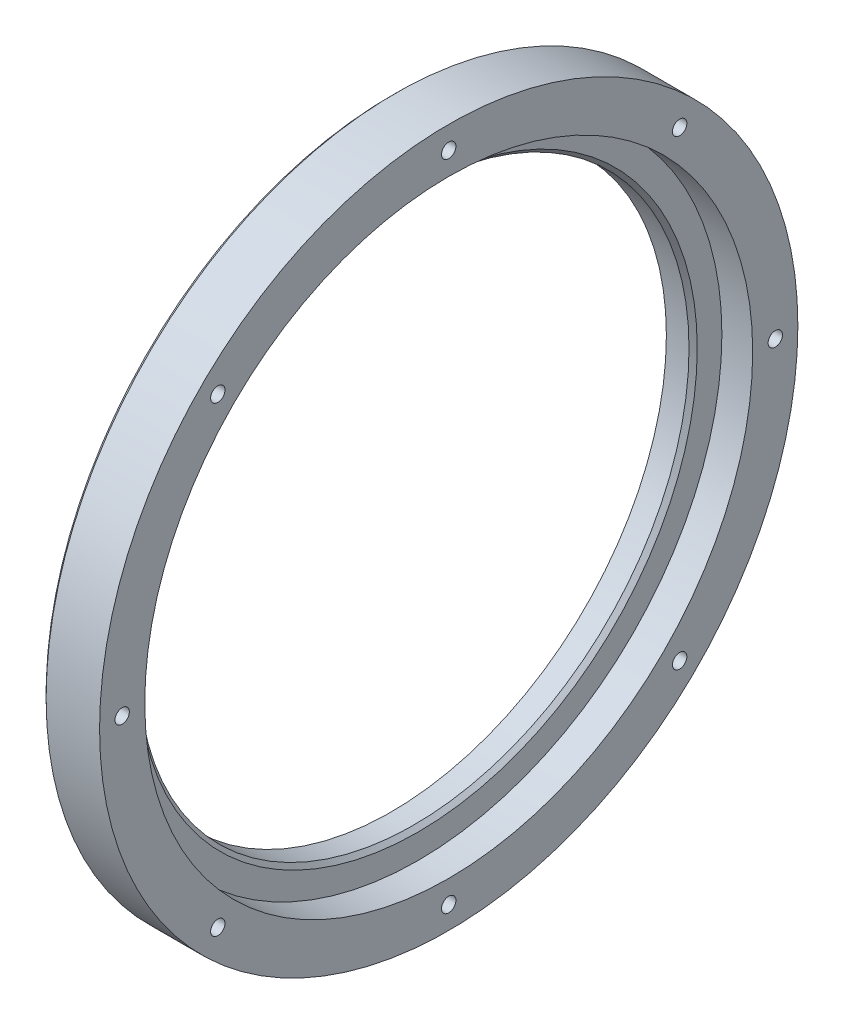
ISO-10303-21;
HEADER;
FILE_DESCRIPTION(('STEP AP214'),'2;1');
FILE_NAME('part.step','',(''),(''),'','','');
FILE_SCHEMA(('AUTOMOTIVE_DESIGN { 1 0 10303 214 1 1 1 1 }'));
ENDSEC;
DATA;
#1=APPLICATION_CONTEXT('core data for automotive mechanical design processes');
#2=APPLICATION_PROTOCOL_DEFINITION('international standard','automotive_design',2000,#1);
#3=PRODUCT_CONTEXT('',#1,'mechanical');
#4=PRODUCT('Part','Part','',(#3));
#5=PRODUCT_RELATED_PRODUCT_CATEGORY('part','',(#4));
#6=PRODUCT_DEFINITION_FORMATION('','',#4);
#7=PRODUCT_DEFINITION_CONTEXT('part definition',#1,'design');
#8=PRODUCT_DEFINITION('design','',#6,#7);
#9=PRODUCT_DEFINITION_SHAPE('','',#8);
#10=(LENGTH_UNIT() NAMED_UNIT(*) SI_UNIT(.MILLI.,.METRE.));
#11=(NAMED_UNIT(*) PLANE_ANGLE_UNIT() SI_UNIT($,.RADIAN.));
#12=(NAMED_UNIT(*) SI_UNIT($,.STERADIAN.) SOLID_ANGLE_UNIT());
#13=UNCERTAINTY_MEASURE_WITH_UNIT(LENGTH_MEASURE(1.E-05),#10,'distance_accuracy_value','');
#14=(GEOMETRIC_REPRESENTATION_CONTEXT(3) GLOBAL_UNCERTAINTY_ASSIGNED_CONTEXT((#13)) GLOBAL_UNIT_ASSIGNED_CONTEXT((#10,
#11,#12)) REPRESENTATION_CONTEXT('',''));
#15=CARTESIAN_POINT('',(0.,0.,0.));
#16=DIRECTION('',(0.,0.,1.));
#17=DIRECTION('',(1.,0.,0.));
#18=AXIS2_PLACEMENT_3D('',#15,#16,#17);
#19=CARTESIAN_POINT('',(-272.858046522507,57.2242590790327,56.2149891043305));
#20=DIRECTION('',(-1.,0.,0.));
#21=DIRECTION('',(0.,0.,1.));
#22=AXIS2_PLACEMENT_3D('',#19,#20,#21);
#23=CYLINDRICAL_SURFACE('',#22,1.75000000000001);
#24=CARTESIAN_POINT('',(-272.858046522507,57.2242590790327,56.2149891043305));
#25=DIRECTION('',(-1.,0.,0.));
#26=DIRECTION('',(0.,0.,1.));
#27=AXIS2_PLACEMENT_3D('',#24,#25,#26);
#28=CIRCLE('',#27,1.75000000000001);
#29=CARTESIAN_POINT('',(-272.858046522507,57.2242590790327,57.9649891043306));
#30=VERTEX_POINT('',#29);
#31=EDGE_CURVE('E92',#30,#30,#28,.T.);
#32=ORIENTED_EDGE('',*,*,#31,.F.);
#33=EDGE_LOOP('',(#32));
#34=FACE_BOUND('',#33,.T.);
#35=CARTESIAN_POINT('',(-282.871214875946,57.2242590790327,56.2149891043305));
#36=DIRECTION('',(-1.,0.,0.));
#37=DIRECTION('',(0.,0.,1.));
#38=AXIS2_PLACEMENT_3D('',#35,#36,#37);
#39=CIRCLE('',#38,1.75000000000001);
#40=CARTESIAN_POINT('',(-282.871214875946,57.2242590790327,57.9649891043306));
#41=VERTEX_POINT('',#40);
#42=EDGE_CURVE('E55',#41,#41,#39,.F.);
#43=ORIENTED_EDGE('',*,*,#42,.F.);
#44=EDGE_LOOP('',(#43));
#45=FACE_BOUND('',#44,.T.);
#46=ADVANCED_FACE('F36',(#34,#45),#23,.F.);
#47=CARTESIAN_POINT('',(-272.858046522507,80.5092699747022,0.));
#48=DIRECTION('',(-1.,0.,0.));
#49=DIRECTION('',(0.,0.,1.));
#50=AXIS2_PLACEMENT_3D('',#47,#48,#49);
#51=CYLINDRICAL_SURFACE('',#50,1.75000000000001);
#52=CARTESIAN_POINT('',(-272.858046522507,80.5092699747022,0.));
#53=DIRECTION('',(-1.,0.,0.));
#54=DIRECTION('',(0.,0.,1.));
#55=AXIS2_PLACEMENT_3D('',#52,#53,#54);
#56=CIRCLE('',#55,1.75000000000001);
#57=CARTESIAN_POINT('',(-272.858046522507,80.5092699747022,1.75000000000001));
#58=VERTEX_POINT('',#57);
#59=EDGE_CURVE('E129',#58,#58,#56,.T.);
#60=ORIENTED_EDGE('',*,*,#59,.F.);
#61=EDGE_LOOP('',(#60));
#62=FACE_BOUND('',#61,.T.);
#63=CARTESIAN_POINT('',(-282.871214875946,80.5092699747022,0.));
#64=DIRECTION('',(-1.,0.,0.));
#65=DIRECTION('',(0.,0.,1.));
#66=AXIS2_PLACEMENT_3D('',#63,#64,#65);
#67=CIRCLE('',#66,1.75000000000001);
#68=CARTESIAN_POINT('',(-282.871214875946,80.5092699747022,1.75000000000001));
#69=VERTEX_POINT('',#68);
#70=EDGE_CURVE('E60',#69,#69,#67,.F.);
#71=ORIENTED_EDGE('',*,*,#70,.F.);
#72=EDGE_LOOP('',(#71));
#73=FACE_BOUND('',#72,.T.);
#74=ADVANCED_FACE('F235',(#62,#73),#51,.F.);
#75=CARTESIAN_POINT('',(-272.858046522507,57.2242590790327,-56.2149891043305));
#76=DIRECTION('',(-1.,0.,0.));
#77=DIRECTION('',(0.,0.,1.));
#78=AXIS2_PLACEMENT_3D('',#75,#76,#77);
#79=CYLINDRICAL_SURFACE('',#78,1.75000000000001);
#80=CARTESIAN_POINT('',(-272.858046522507,57.2242590790327,-56.2149891043305));
#81=DIRECTION('',(-1.,0.,0.));
#82=DIRECTION('',(0.,0.,1.));
#83=AXIS2_PLACEMENT_3D('',#80,#81,#82);
#84=CIRCLE('',#83,1.75000000000001);
#85=CARTESIAN_POINT('',(-272.858046522507,57.2242590790327,-54.4649891043305));
#86=VERTEX_POINT('',#85);
#87=EDGE_CURVE('E126',#86,#86,#84,.T.);
#88=ORIENTED_EDGE('',*,*,#87,.F.);
#89=EDGE_LOOP('',(#88));
#90=FACE_BOUND('',#89,.T.);
#91=CARTESIAN_POINT('',(-282.871214875946,57.2242590790327,-56.2149891043305));
#92=DIRECTION('',(-1.,0.,0.));
#93=DIRECTION('',(0.,0.,1.));
#94=AXIS2_PLACEMENT_3D('',#91,#92,#93);
#95=CIRCLE('',#94,1.75000000000001);
#96=CARTESIAN_POINT('',(-282.871214875946,57.2242590790327,-54.4649891043305));
#97=VERTEX_POINT('',#96);
#98=EDGE_CURVE('E65',#97,#97,#95,.F.);
#99=ORIENTED_EDGE('',*,*,#98,.F.);
#100=EDGE_LOOP('',(#99));
#101=FACE_BOUND('',#100,.T.);
#102=ADVANCED_FACE('F241',(#90,#101),#79,.F.);
#103=CARTESIAN_POINT('',(-272.858046522507,1.00926997470218,-79.5));
#104=DIRECTION('',(-1.,0.,0.));
#105=DIRECTION('',(0.,0.,1.));
#106=AXIS2_PLACEMENT_3D('',#103,#104,#105);
#107=CYLINDRICAL_SURFACE('',#106,1.75);
#108=CARTESIAN_POINT('',(-272.858046522507,1.00926997470218,-79.5));
#109=DIRECTION('',(-1.,0.,0.));
#110=DIRECTION('',(0.,0.,1.));
#111=AXIS2_PLACEMENT_3D('',#108,#109,#110);
#112=CIRCLE('',#111,1.75);
#113=CARTESIAN_POINT('',(-272.858046522507,1.00926997470218,-77.75));
#114=VERTEX_POINT('',#113);
#115=EDGE_CURVE('E123',#114,#114,#112,.T.);
#116=ORIENTED_EDGE('',*,*,#115,.F.);
#117=EDGE_LOOP('',(#116));
#118=FACE_BOUND('',#117,.T.);
#119=CARTESIAN_POINT('',(-282.871214875946,1.00926997470218,-79.5));
#120=DIRECTION('',(-1.,0.,0.));
#121=DIRECTION('',(0.,0.,1.));
#122=AXIS2_PLACEMENT_3D('',#119,#120,#121);
#123=CIRCLE('',#122,1.75);
#124=CARTESIAN_POINT('',(-282.871214875946,1.00926997470218,-77.75));
#125=VERTEX_POINT('',#124);
#126=EDGE_CURVE('E70',#125,#125,#123,.F.);
#127=ORIENTED_EDGE('',*,*,#126,.F.);
#128=EDGE_LOOP('',(#127));
#129=FACE_BOUND('',#128,.T.);
#130=ADVANCED_FACE('F252',(#118,#129),#107,.F.);
#131=CARTESIAN_POINT('',(-272.858046522507,-55.2057191296284,-56.2149891043306));
#132=DIRECTION('',(-1.,0.,0.));
#133=DIRECTION('',(0.,0.,1.));
#134=AXIS2_PLACEMENT_3D('',#131,#132,#133);
#135=CYLINDRICAL_SURFACE('',#134,1.75000000000001);
#136=CARTESIAN_POINT('',(-272.858046522507,-55.2057191296284,-56.2149891043306));
#137=DIRECTION('',(-1.,0.,0.));
#138=DIRECTION('',(0.,0.,1.));
#139=AXIS2_PLACEMENT_3D('',#136,#137,#138);
#140=CIRCLE('',#139,1.75000000000001);
#141=CARTESIAN_POINT('',(-272.858046522507,-55.2057191296284,-54.4649891043305));
#142=VERTEX_POINT('',#141);
#143=EDGE_CURVE('E120',#142,#142,#140,.T.);
#144=ORIENTED_EDGE('',*,*,#143,.F.);
#145=EDGE_LOOP('',(#144));
#146=FACE_BOUND('',#145,.T.);
#147=CARTESIAN_POINT('',(-282.871214875946,-55.2057191296284,-56.2149891043306));
#148=DIRECTION('',(-1.,0.,0.));
#149=DIRECTION('',(0.,0.,1.));
#150=AXIS2_PLACEMENT_3D('',#147,#148,#149);
#151=CIRCLE('',#150,1.75000000000001);
#152=CARTESIAN_POINT('',(-282.871214875946,-55.2057191296284,-54.4649891043305));
#153=VERTEX_POINT('',#152);
#154=EDGE_CURVE('E75',#153,#153,#151,.F.);
#155=ORIENTED_EDGE('',*,*,#154,.F.);
#156=EDGE_LOOP('',(#155));
#157=FACE_BOUND('',#156,.T.);
#158=ADVANCED_FACE('F256',(#146,#157),#135,.F.);
#159=CARTESIAN_POINT('',(-272.858046522507,-78.4907300252979,0.));
#160=DIRECTION('',(-1.,0.,0.));
#161=DIRECTION('',(0.,0.,1.));
#162=AXIS2_PLACEMENT_3D('',#159,#160,#161);
#163=CYLINDRICAL_SURFACE('',#162,1.75000000000001);
#164=CARTESIAN_POINT('',(-272.858046522507,-78.4907300252979,0.));
#165=DIRECTION('',(-1.,0.,0.));
#166=DIRECTION('',(0.,0.,1.));
#167=AXIS2_PLACEMENT_3D('',#164,#165,#166);
#168=CIRCLE('',#167,1.75000000000001);
#169=CARTESIAN_POINT('',(-272.858046522507,-78.4907300252979,1.75));
#170=VERTEX_POINT('',#169);
#171=EDGE_CURVE('E117',#170,#170,#168,.T.);
#172=ORIENTED_EDGE('',*,*,#171,.F.);
#173=EDGE_LOOP('',(#172));
#174=FACE_BOUND('',#173,.T.);
#175=CARTESIAN_POINT('',(-282.871214875946,-78.4907300252979,0.));
#176=DIRECTION('',(-1.,0.,0.));
#177=DIRECTION('',(0.,0.,1.));
#178=AXIS2_PLACEMENT_3D('',#175,#176,#177);
#179=CIRCLE('',#178,1.75000000000001);
#180=CARTESIAN_POINT('',(-282.871214875946,-78.4907300252979,1.75));
#181=VERTEX_POINT('',#180);
#182=EDGE_CURVE('E80',#181,#181,#179,.F.);
#183=ORIENTED_EDGE('',*,*,#182,.F.);
#184=EDGE_LOOP('',(#183));
#185=FACE_BOUND('',#184,.T.);
#186=ADVANCED_FACE('F260',(#174,#185),#163,.F.);
#187=CARTESIAN_POINT('',(-272.858046522507,-55.2057191296284,56.2149891043305));
#188=DIRECTION('',(-1.,0.,0.));
#189=DIRECTION('',(0.,0.,1.));
#190=AXIS2_PLACEMENT_3D('',#187,#188,#189);
#191=CYLINDRICAL_SURFACE('',#190,1.75000000000001);
#192=CARTESIAN_POINT('',(-272.858046522507,-55.2057191296284,56.2149891043305));
#193=DIRECTION('',(-1.,0.,0.));
#194=DIRECTION('',(0.,0.,1.));
#195=AXIS2_PLACEMENT_3D('',#192,#193,#194);
#196=CIRCLE('',#195,1.75000000000001);
#197=CARTESIAN_POINT('',(-272.858046522507,-55.2057191296284,57.9649891043306));
#198=VERTEX_POINT('',#197);
#199=EDGE_CURVE('E114',#198,#198,#196,.T.);
#200=ORIENTED_EDGE('',*,*,#199,.F.);
#201=EDGE_LOOP('',(#200));
#202=FACE_BOUND('',#201,.T.);
#203=CARTESIAN_POINT('',(-282.871214875946,-55.2057191296284,56.2149891043305));
#204=DIRECTION('',(-1.,0.,0.));
#205=DIRECTION('',(0.,0.,1.));
#206=AXIS2_PLACEMENT_3D('',#203,#204,#205);
#207=CIRCLE('',#206,1.75000000000001);
#208=CARTESIAN_POINT('',(-282.871214875946,-55.2057191296284,57.9649891043306));
#209=VERTEX_POINT('',#208);
#210=EDGE_CURVE('E85',#209,#209,#207,.F.);
#211=ORIENTED_EDGE('',*,*,#210,.F.);
#212=EDGE_LOOP('',(#211));
#213=FACE_BOUND('',#212,.T.);
#214=ADVANCED_FACE('F264',(#202,#213),#191,.F.);
#215=CARTESIAN_POINT('',(-272.858046522507,1.00926997470216,79.5));
#216=DIRECTION('',(-1.,0.,0.));
#217=DIRECTION('',(0.,0.,1.));
#218=AXIS2_PLACEMENT_3D('',#215,#216,#217);
#219=CYLINDRICAL_SURFACE('',#218,1.75000000000001);
#220=CARTESIAN_POINT('',(-272.858046522507,1.00926997470216,79.5));
#221=DIRECTION('',(-1.,0.,0.));
#222=DIRECTION('',(0.,0.,1.));
#223=AXIS2_PLACEMENT_3D('',#220,#221,#222);
#224=CIRCLE('',#223,1.75000000000001);
#225=CARTESIAN_POINT('',(-272.858046522507,1.00926997470216,81.25));
#226=VERTEX_POINT('',#225);
#227=EDGE_CURVE('E111',#226,#226,#224,.T.);
#228=ORIENTED_EDGE('',*,*,#227,.F.);
#229=EDGE_LOOP('',(#228));
#230=FACE_BOUND('',#229,.T.);
#231=CARTESIAN_POINT('',(-282.871214875946,1.00926997470216,79.5));
#232=DIRECTION('',(-1.,0.,0.));
#233=DIRECTION('',(0.,0.,1.));
#234=AXIS2_PLACEMENT_3D('',#231,#232,#233);
#235=CIRCLE('',#234,1.75000000000001);
#236=CARTESIAN_POINT('',(-282.871214875946,1.00926997470216,81.25));
#237=VERTEX_POINT('',#236);
#238=EDGE_CURVE('E90',#237,#237,#235,.F.);
#239=ORIENTED_EDGE('',*,*,#238,.F.);
#240=EDGE_LOOP('',(#239));
#241=FACE_BOUND('',#240,.T.);
#242=ADVANCED_FACE('F218',(#230,#241),#219,.F.);
#243=CARTESIAN_POINT('',(-272.858046522507,75.0092699747022,0.));
#244=DIRECTION('',(1.,0.,0.));
#245=DIRECTION('',(0.,0.,-1.));
#246=AXIS2_PLACEMENT_3D('',#243,#244,#245);
#247=PLANE('',#246);
#248=ORIENTED_EDGE('',*,*,#31,.T.);
#249=EDGE_LOOP('',(#248));
#250=FACE_BOUND('',#249,.T.);
#251=ORIENTED_EDGE('',*,*,#59,.T.);
#252=EDGE_LOOP('',(#251));
#253=FACE_BOUND('',#252,.T.);
#254=ORIENTED_EDGE('',*,*,#87,.T.);
#255=EDGE_LOOP('',(#254));
#256=FACE_BOUND('',#255,.T.);
#257=ORIENTED_EDGE('',*,*,#115,.T.);
#258=EDGE_LOOP('',(#257));
#259=FACE_BOUND('',#258,.T.);
#260=ORIENTED_EDGE('',*,*,#143,.T.);
#261=EDGE_LOOP('',(#260));
#262=FACE_BOUND('',#261,.T.);
#263=ORIENTED_EDGE('',*,*,#171,.T.);
#264=EDGE_LOOP('',(#263));
#265=FACE_BOUND('',#264,.T.);
#266=ORIENTED_EDGE('',*,*,#199,.T.);
#267=EDGE_LOOP('',(#266));
#268=FACE_BOUND('',#267,.T.);
#269=ORIENTED_EDGE('',*,*,#227,.T.);
#270=EDGE_LOOP('',(#269));
#271=FACE_BOUND('',#270,.T.);
#272=CARTESIAN_POINT('',(-272.858046522507,1.00926997470217,0.));
#273=DIRECTION('',(1.,0.,0.));
#274=DIRECTION('',(0.,0.,-1.));
#275=AXIS2_PLACEMENT_3D('',#272,#273,#274);
#276=CIRCLE('',#275,85.);
#277=CARTESIAN_POINT('',(-272.858046522507,1.00926997470217,-85.));
#278=VERTEX_POINT('',#277);
#279=EDGE_CURVE('E107',#278,#278,#276,.T.);
#280=ORIENTED_EDGE('',*,*,#279,.T.);
#281=EDGE_LOOP('',(#280));
#282=FACE_BOUND('',#281,.T.);
#283=CARTESIAN_POINT('',(-272.858046522507,1.00926997470217,0.));
#284=DIRECTION('',(1.,0.,0.));
#285=DIRECTION('',(0.,0.,-1.));
#286=AXIS2_PLACEMENT_3D('',#283,#284,#285);
#287=CIRCLE('',#286,74.);
#288=CARTESIAN_POINT('',(-272.858046522507,1.00926997470217,-74.));
#289=VERTEX_POINT('',#288);
#290=EDGE_CURVE('E47',#289,#289,#287,.T.);
#291=ORIENTED_EDGE('',*,*,#290,.F.);
#292=EDGE_LOOP('',(#291));
#293=FACE_BOUND('',#292,.T.);
#294=ADVANCED_FACE('F214',(#250,#253,#256,#259,#262,#265,#268,#271,#282,#293),#247,.T.);
#295=CARTESIAN_POINT('',(-268.908046522507,1.00926997470217,0.));
#296=DIRECTION('',(1.,0.,0.));
#297=DIRECTION('',(0.,0.,-1.));
#298=AXIS2_PLACEMENT_3D('',#295,#296,#297);
#299=CYLINDRICAL_SURFACE('',#298,74.);
#300=ORIENTED_EDGE('',*,*,#290,.T.);
#301=EDGE_LOOP('',(#300));
#302=FACE_BOUND('',#301,.T.);
#303=CARTESIAN_POINT('',(-280.358046522507,1.00926997470217,0.));
#304=DIRECTION('',(1.,0.,0.));
#305=DIRECTION('',(0.,0.,-1.));
#306=AXIS2_PLACEMENT_3D('',#303,#304,#305);
#307=CIRCLE('',#306,74.);
#308=CARTESIAN_POINT('',(-280.358046522507,1.00926997470217,-74.));
#309=VERTEX_POINT('',#308);
#310=EDGE_CURVE('E52',#309,#309,#307,.T.);
#311=ORIENTED_EDGE('',*,*,#310,.F.);
#312=EDGE_LOOP('',(#311));
#313=FACE_BOUND('',#312,.T.);
#314=ADVANCED_FACE('F217',(#302,#313),#299,.F.);
#315=CARTESIAN_POINT('',(-280.358046522507,75.0092699747022,0.));
#316=DIRECTION('',(1.,0.,0.));
#317=DIRECTION('',(0.,0.,-1.));
#318=AXIS2_PLACEMENT_3D('',#315,#316,#317);
#319=PLANE('',#318);
#320=CARTESIAN_POINT('',(-280.358046522507,1.00926997470217,0.));
#321=DIRECTION('',(1.,0.,0.));
#322=DIRECTION('',(0.,0.,-1.));
#323=AXIS2_PLACEMENT_3D('',#320,#321,#322);
#324=CIRCLE('',#323,68.);
#325=CARTESIAN_POINT('',(-280.358046522507,1.00926997470217,-68.));
#326=VERTEX_POINT('',#325);
#327=EDGE_CURVE('E10',#326,#326,#324,.F.);
#328=ORIENTED_EDGE('',*,*,#327,.T.);
#329=EDGE_LOOP('',(#328));
#330=FACE_BOUND('',#329,.T.);
#331=ORIENTED_EDGE('',*,*,#310,.T.);
#332=EDGE_LOOP('',(#331));
#333=FACE_BOUND('',#332,.T.);
#334=ADVANCED_FACE('F224',(#330,#333),#319,.T.);
#335=CARTESIAN_POINT('',(-268.908046522507,1.00926997470217,0.));
#336=DIRECTION('',(1.,0.,0.));
#337=DIRECTION('',(0.,0.,-1.));
#338=AXIS2_PLACEMENT_3D('',#335,#336,#337);
#339=CYLINDRICAL_SURFACE('',#338,67.);
#340=CARTESIAN_POINT('',(-281.358046522507,1.00926997470217,0.));
#341=DIRECTION('',(1.,0.,0.));
#342=DIRECTION('',(0.,0.,-1.));
#343=AXIS2_PLACEMENT_3D('',#340,#341,#342);
#344=CIRCLE('',#343,67.);
#345=CARTESIAN_POINT('',(-281.358046522507,1.00926997470217,-67.));
#346=VERTEX_POINT('',#345);
#347=EDGE_CURVE('E43',#346,#346,#344,.T.);
#348=ORIENTED_EDGE('',*,*,#347,.T.);
#349=EDGE_LOOP('',(#348));
#350=FACE_BOUND('',#349,.T.);
#351=CARTESIAN_POINT('',(-286.871214875946,1.00926997470217,0.));
#352=DIRECTION('',(1.,0.,0.));
#353=DIRECTION('',(0.,0.,-1.));
#354=AXIS2_PLACEMENT_3D('',#351,#352,#353);
#355=CIRCLE('',#354,67.);
#356=CARTESIAN_POINT('',(-286.871214875946,1.00926997470217,-67.));
#357=VERTEX_POINT('',#356);
#358=EDGE_CURVE('E98',#357,#357,#355,.T.);
#359=ORIENTED_EDGE('',*,*,#358,.F.);
#360=EDGE_LOOP('',(#359));
#361=FACE_BOUND('',#360,.T.);
#362=ADVANCED_FACE('F182',(#350,#361),#339,.F.);
#363=CARTESIAN_POINT('',(-286.871214875946,68.0092699747022,0.));
#364=DIRECTION('',(-1.,0.,0.));
#365=DIRECTION('',(0.,0.,1.));
#366=AXIS2_PLACEMENT_3D('',#363,#364,#365);
#367=PLANE('',#366);
#368=CARTESIAN_POINT('',(-286.871214875946,57.2242590790327,56.2149891043305));
#369=DIRECTION('',(-1.,0.,0.));
#370=DIRECTION('',(0.,0.,1.));
#371=AXIS2_PLACEMENT_3D('',#368,#369,#370);
#372=CIRCLE('',#371,3.00000000000002);
#373=CARTESIAN_POINT('',(-286.871214875946,57.2242590790327,59.2149891043306));
#374=VERTEX_POINT('',#373);
#375=EDGE_CURVE('E163',#374,#374,#372,.T.);
#376=ORIENTED_EDGE('',*,*,#375,.F.);
#377=EDGE_LOOP('',(#376));
#378=FACE_BOUND('',#377,.T.);
#379=CARTESIAN_POINT('',(-286.871214875946,80.5092699747022,0.));
#380=DIRECTION('',(-1.,0.,0.));
#381=DIRECTION('',(0.,0.,1.));
#382=AXIS2_PLACEMENT_3D('',#379,#380,#381);
#383=CIRCLE('',#382,3.00000000000001);
#384=CARTESIAN_POINT('',(-286.871214875946,80.5092699747022,3.00000000000001));
#385=VERTEX_POINT('',#384);
#386=EDGE_CURVE('E58',#385,#385,#383,.T.);
#387=ORIENTED_EDGE('',*,*,#386,.F.);
#388=EDGE_LOOP('',(#387));
#389=FACE_BOUND('',#388,.T.);
#390=CARTESIAN_POINT('',(-286.871214875946,57.2242590790327,-56.2149891043305));
#391=DIRECTION('',(-1.,0.,0.));
#392=DIRECTION('',(0.,0.,1.));
#393=AXIS2_PLACEMENT_3D('',#390,#391,#392);
#394=CIRCLE('',#393,3.00000000000001);
#395=CARTESIAN_POINT('',(-286.871214875946,57.2242590790327,-53.2149891043305));
#396=VERTEX_POINT('',#395);
#397=EDGE_CURVE('E63',#396,#396,#394,.T.);
#398=ORIENTED_EDGE('',*,*,#397,.F.);
#399=EDGE_LOOP('',(#398));
#400=FACE_BOUND('',#399,.T.);
#401=CARTESIAN_POINT('',(-286.871214875946,1.00926997470217,-79.5));
#402=DIRECTION('',(-1.,0.,0.));
#403=DIRECTION('',(0.,0.,1.));
#404=AXIS2_PLACEMENT_3D('',#401,#402,#403);
#405=CIRCLE('',#404,3.00000000000002);
#406=CARTESIAN_POINT('',(-286.871214875946,1.00926997470217,-76.5));
#407=VERTEX_POINT('',#406);
#408=EDGE_CURVE('E68',#407,#407,#405,.T.);
#409=ORIENTED_EDGE('',*,*,#408,.F.);
#410=EDGE_LOOP('',(#409));
#411=FACE_BOUND('',#410,.T.);
#412=CARTESIAN_POINT('',(-286.871214875946,-55.2057191296284,-56.2149891043306));
#413=DIRECTION('',(-1.,0.,0.));
#414=DIRECTION('',(0.,0.,1.));
#415=AXIS2_PLACEMENT_3D('',#412,#413,#414);
#416=CIRCLE('',#415,3.00000000000001);
#417=CARTESIAN_POINT('',(-286.871214875946,-55.2057191296284,-53.2149891043305));
#418=VERTEX_POINT('',#417);
#419=EDGE_CURVE('E73',#418,#418,#416,.T.);
#420=ORIENTED_EDGE('',*,*,#419,.F.);
#421=EDGE_LOOP('',(#420));
#422=FACE_BOUND('',#421,.T.);
#423=CARTESIAN_POINT('',(-286.871214875946,-78.4907300252979,0.));
#424=DIRECTION('',(-1.,0.,0.));
#425=DIRECTION('',(0.,0.,1.));
#426=AXIS2_PLACEMENT_3D('',#423,#424,#425);
#427=CIRCLE('',#426,3.00000000000002);
#428=CARTESIAN_POINT('',(-286.871214875946,-78.4907300252979,3.00000000000001));
#429=VERTEX_POINT('',#428);
#430=EDGE_CURVE('E78',#429,#429,#427,.T.);
#431=ORIENTED_EDGE('',*,*,#430,.F.);
#432=EDGE_LOOP('',(#431));
#433=FACE_BOUND('',#432,.T.);
#434=CARTESIAN_POINT('',(-286.871214875946,-55.2057191296284,56.2149891043305));
#435=DIRECTION('',(-1.,0.,0.));
#436=DIRECTION('',(0.,0.,1.));
#437=AXIS2_PLACEMENT_3D('',#434,#435,#436);
#438=CIRCLE('',#437,3.00000000000002);
#439=CARTESIAN_POINT('',(-286.871214875946,-55.2057191296284,59.2149891043306));
#440=VERTEX_POINT('',#439);
#441=EDGE_CURVE('E83',#440,#440,#438,.T.);
#442=ORIENTED_EDGE('',*,*,#441,.F.);
#443=EDGE_LOOP('',(#442));
#444=FACE_BOUND('',#443,.T.);
#445=CARTESIAN_POINT('',(-286.871214875946,1.00926997470216,79.5));
#446=DIRECTION('',(-1.,0.,0.));
#447=DIRECTION('',(0.,0.,1.));
#448=AXIS2_PLACEMENT_3D('',#445,#446,#447);
#449=CIRCLE('',#448,3.00000000000002);
#450=CARTESIAN_POINT('',(-286.871214875946,1.00926997470216,82.5));
#451=VERTEX_POINT('',#450);
#452=EDGE_CURVE('E88',#451,#451,#449,.T.);
#453=ORIENTED_EDGE('',*,*,#452,.F.);
#454=EDGE_LOOP('',(#453));
#455=FACE_BOUND('',#454,.T.);
#456=ORIENTED_EDGE('',*,*,#358,.T.);
#457=EDGE_LOOP('',(#456));
#458=FACE_BOUND('',#457,.T.);
#459=CARTESIAN_POINT('',(-286.871214875946,1.00926997470217,0.));
#460=DIRECTION('',(1.,0.,0.));
#461=DIRECTION('',(0.,0.,-1.));
#462=AXIS2_PLACEMENT_3D('',#459,#460,#461);
#463=CIRCLE('',#462,84.);
#464=CARTESIAN_POINT('',(-286.871214875946,1.00926997470217,-84.));
#465=VERTEX_POINT('',#464);
#466=EDGE_CURVE('E101',#465,#465,#463,.T.);
#467=ORIENTED_EDGE('',*,*,#466,.F.);
#468=EDGE_LOOP('',(#467));
#469=FACE_BOUND('',#468,.T.);
#470=ADVANCED_FACE('F178',(#378,#389,#400,#411,#422,#433,#444,#455,#458,#469),#367,.T.);
#471=CARTESIAN_POINT('',(-285.871214875946,1.00926997470217,0.));
#472=DIRECTION('',(1.,0.,0.));
#473=DIRECTION('',(0.,0.,-1.));
#474=AXIS2_PLACEMENT_3D('',#471,#472,#473);
#475=CONICAL_SURFACE('',#474,85.,0.785398163397448);
#476=ORIENTED_EDGE('',*,*,#466,.T.);
#477=EDGE_LOOP('',(#476));
#478=FACE_BOUND('',#477,.T.);
#479=CARTESIAN_POINT('',(-285.871214875946,1.00926997470217,0.));
#480=DIRECTION('',(1.,0.,0.));
#481=DIRECTION('',(0.,0.,-1.));
#482=AXIS2_PLACEMENT_3D('',#479,#480,#481);
#483=CIRCLE('',#482,85.);
#484=CARTESIAN_POINT('',(-285.871214875946,1.00926997470217,-85.));
#485=VERTEX_POINT('',#484);
#486=EDGE_CURVE('E104',#485,#485,#483,.T.);
#487=ORIENTED_EDGE('',*,*,#486,.F.);
#488=EDGE_LOOP('',(#487));
#489=FACE_BOUND('',#488,.T.);
#490=ADVANCED_FACE('F181',(#478,#489),#475,.T.);
#491=CARTESIAN_POINT('',(-268.908046522507,1.00926997470217,0.));
#492=DIRECTION('',(1.,0.,0.));
#493=DIRECTION('',(0.,0.,-1.));
#494=AXIS2_PLACEMENT_3D('',#491,#492,#493);
#495=CYLINDRICAL_SURFACE('',#494,85.);
#496=ORIENTED_EDGE('',*,*,#486,.T.);
#497=EDGE_LOOP('',(#496));
#498=FACE_BOUND('',#497,.T.);
#499=ORIENTED_EDGE('',*,*,#279,.F.);
#500=EDGE_LOOP('',(#499));
#501=FACE_BOUND('',#500,.T.);
#502=ADVANCED_FACE('F204',(#498,#501),#495,.T.);
#503=CARTESIAN_POINT('',(-282.871214875946,1.00926997470216,79.5));
#504=DIRECTION('',(-1.,0.,0.));
#505=DIRECTION('',(0.,0.,1.));
#506=AXIS2_PLACEMENT_3D('',#503,#504,#505);
#507=PLANE('',#506);
#508=CARTESIAN_POINT('',(-282.871214875946,1.00926997470216,79.5));
#509=DIRECTION('',(-1.,0.,0.));
#510=DIRECTION('',(0.,0.,1.));
#511=AXIS2_PLACEMENT_3D('',#508,#509,#510);
#512=CIRCLE('',#511,3.00000000000002);
#513=CARTESIAN_POINT('',(-282.871214875946,1.00926997470216,82.5));
#514=VERTEX_POINT('',#513);
#515=EDGE_CURVE('E93',#514,#514,#512,.T.);
#516=ORIENTED_EDGE('',*,*,#515,.T.);
#517=EDGE_LOOP('',(#516));
#518=FACE_BOUND('',#517,.T.);
#519=ORIENTED_EDGE('',*,*,#238,.T.);
#520=EDGE_LOOP('',(#519));
#521=FACE_BOUND('',#520,.T.);
#522=ADVANCED_FACE('F210',(#518,#521),#507,.T.);
#523=CARTESIAN_POINT('',(-282.871214875946,1.00926997470216,79.5));
#524=DIRECTION('',(-1.,0.,0.));
#525=DIRECTION('',(0.,0.,1.));
#526=AXIS2_PLACEMENT_3D('',#523,#524,#525);
#527=CYLINDRICAL_SURFACE('',#526,3.00000000000002);
#528=ORIENTED_EDGE('',*,*,#515,.F.);
#529=EDGE_LOOP('',(#528));
#530=FACE_BOUND('',#529,.T.);
#531=ORIENTED_EDGE('',*,*,#452,.T.);
#532=EDGE_LOOP('',(#531));
#533=FACE_BOUND('',#532,.T.);
#534=ADVANCED_FACE('F247',(#530,#533),#527,.F.);
#535=CARTESIAN_POINT('',(-282.871214875946,-55.2057191296284,56.2149891043305));
#536=DIRECTION('',(-1.,0.,0.));
#537=DIRECTION('',(0.,0.,1.));
#538=AXIS2_PLACEMENT_3D('',#535,#536,#537);
#539=PLANE('',#538);
#540=CARTESIAN_POINT('',(-282.871214875946,-55.2057191296284,56.2149891043305));
#541=DIRECTION('',(-1.,0.,0.));
#542=DIRECTION('',(0.,0.,1.));
#543=AXIS2_PLACEMENT_3D('',#540,#541,#542);
#544=CIRCLE('',#543,3.00000000000002);
#545=CARTESIAN_POINT('',(-282.871214875946,-55.2057191296284,59.2149891043306));
#546=VERTEX_POINT('',#545);
#547=EDGE_CURVE('E89',#546,#546,#544,.T.);
#548=ORIENTED_EDGE('',*,*,#547,.T.);
#549=EDGE_LOOP('',(#548));
#550=FACE_BOUND('',#549,.T.);
#551=ORIENTED_EDGE('',*,*,#210,.T.);
#552=EDGE_LOOP('',(#551));
#553=FACE_BOUND('',#552,.T.);
#554=ADVANCED_FACE('F282',(#550,#553),#539,.T.);
#555=CARTESIAN_POINT('',(-282.871214875946,-55.2057191296284,56.2149891043305));
#556=DIRECTION('',(-1.,0.,0.));
#557=DIRECTION('',(0.,0.,1.));
#558=AXIS2_PLACEMENT_3D('',#555,#556,#557);
#559=CYLINDRICAL_SURFACE('',#558,3.00000000000002);
#560=ORIENTED_EDGE('',*,*,#547,.F.);
#561=EDGE_LOOP('',(#560));
#562=FACE_BOUND('',#561,.T.);
#563=ORIENTED_EDGE('',*,*,#441,.T.);
#564=EDGE_LOOP('',(#563));
#565=FACE_BOUND('',#564,.T.);
#566=ADVANCED_FACE('F285',(#562,#565),#559,.F.);
#567=CARTESIAN_POINT('',(-282.871214875946,-78.4907300252979,0.));
#568=DIRECTION('',(-1.,0.,0.));
#569=DIRECTION('',(0.,0.,1.));
#570=AXIS2_PLACEMENT_3D('',#567,#568,#569);
#571=PLANE('',#570);
#572=CARTESIAN_POINT('',(-282.871214875946,-78.4907300252979,0.));
#573=DIRECTION('',(-1.,0.,0.));
#574=DIRECTION('',(0.,0.,1.));
#575=AXIS2_PLACEMENT_3D('',#572,#573,#574);
#576=CIRCLE('',#575,3.00000000000002);
#577=CARTESIAN_POINT('',(-282.871214875946,-78.4907300252979,3.00000000000001));
#578=VERTEX_POINT('',#577);
#579=EDGE_CURVE('E84',#578,#578,#576,.T.);
#580=ORIENTED_EDGE('',*,*,#579,.T.);
#581=EDGE_LOOP('',(#580));
#582=FACE_BOUND('',#581,.T.);
#583=ORIENTED_EDGE('',*,*,#182,.T.);
#584=EDGE_LOOP('',(#583));
#585=FACE_BOUND('',#584,.T.);
#586=ADVANCED_FACE('F288',(#582,#585),#571,.T.);
#587=CARTESIAN_POINT('',(-282.871214875946,-78.4907300252979,0.));
#588=DIRECTION('',(-1.,0.,0.));
#589=DIRECTION('',(0.,0.,1.));
#590=AXIS2_PLACEMENT_3D('',#587,#588,#589);
#591=CYLINDRICAL_SURFACE('',#590,3.00000000000002);
#592=ORIENTED_EDGE('',*,*,#579,.F.);
#593=EDGE_LOOP('',(#592));
#594=FACE_BOUND('',#593,.T.);
#595=ORIENTED_EDGE('',*,*,#430,.T.);
#596=EDGE_LOOP('',(#595));
#597=FACE_BOUND('',#596,.T.);
#598=ADVANCED_FACE('F293',(#594,#597),#591,.F.);
#599=CARTESIAN_POINT('',(-282.871214875946,-55.2057191296284,-56.2149891043306));
#600=DIRECTION('',(-1.,0.,0.));
#601=DIRECTION('',(0.,0.,1.));
#602=AXIS2_PLACEMENT_3D('',#599,#600,#601);
#603=PLANE('',#602);
#604=CARTESIAN_POINT('',(-282.871214875946,-55.2057191296284,-56.2149891043306));
#605=DIRECTION('',(-1.,0.,0.));
#606=DIRECTION('',(0.,0.,1.));
#607=AXIS2_PLACEMENT_3D('',#604,#605,#606);
#608=CIRCLE('',#607,3.00000000000001);
#609=CARTESIAN_POINT('',(-282.871214875946,-55.2057191296284,-53.2149891043305));
#610=VERTEX_POINT('',#609);
#611=EDGE_CURVE('E79',#610,#610,#608,.T.);
#612=ORIENTED_EDGE('',*,*,#611,.T.);
#613=EDGE_LOOP('',(#612));
#614=FACE_BOUND('',#613,.T.);
#615=ORIENTED_EDGE('',*,*,#154,.T.);
#616=EDGE_LOOP('',(#615));
#617=FACE_BOUND('',#616,.T.);
#618=ADVANCED_FACE('F296',(#614,#617),#603,.T.);
#619=CARTESIAN_POINT('',(-282.871214875946,-55.2057191296284,-56.2149891043306));
#620=DIRECTION('',(-1.,0.,0.));
#621=DIRECTION('',(0.,0.,1.));
#622=AXIS2_PLACEMENT_3D('',#619,#620,#621);
#623=CYLINDRICAL_SURFACE('',#622,3.00000000000001);
#624=ORIENTED_EDGE('',*,*,#611,.F.);
#625=EDGE_LOOP('',(#624));
#626=FACE_BOUND('',#625,.T.);
#627=ORIENTED_EDGE('',*,*,#419,.T.);
#628=EDGE_LOOP('',(#627));
#629=FACE_BOUND('',#628,.T.);
#630=ADVANCED_FACE('F301',(#626,#629),#623,.F.);
#631=CARTESIAN_POINT('',(-282.871214875946,1.00926997470217,-79.5));
#632=DIRECTION('',(-1.,0.,0.));
#633=DIRECTION('',(0.,0.,1.));
#634=AXIS2_PLACEMENT_3D('',#631,#632,#633);
#635=PLANE('',#634);
#636=CARTESIAN_POINT('',(-282.871214875946,1.00926997470217,-79.5));
#637=DIRECTION('',(-1.,0.,0.));
#638=DIRECTION('',(0.,0.,1.));
#639=AXIS2_PLACEMENT_3D('',#636,#637,#638);
#640=CIRCLE('',#639,3.00000000000002);
#641=CARTESIAN_POINT('',(-282.871214875946,1.00926997470217,-76.5));
#642=VERTEX_POINT('',#641);
#643=EDGE_CURVE('E74',#642,#642,#640,.T.);
#644=ORIENTED_EDGE('',*,*,#643,.T.);
#645=EDGE_LOOP('',(#644));
#646=FACE_BOUND('',#645,.T.);
#647=ORIENTED_EDGE('',*,*,#126,.T.);
#648=EDGE_LOOP('',(#647));
#649=FACE_BOUND('',#648,.T.);
#650=ADVANCED_FACE('F304',(#646,#649),#635,.T.);
#651=CARTESIAN_POINT('',(-282.871214875946,1.00926997470217,-79.5));
#652=DIRECTION('',(-1.,0.,0.));
#653=DIRECTION('',(0.,0.,1.));
#654=AXIS2_PLACEMENT_3D('',#651,#652,#653);
#655=CYLINDRICAL_SURFACE('',#654,3.00000000000002);
#656=ORIENTED_EDGE('',*,*,#643,.F.);
#657=EDGE_LOOP('',(#656));
#658=FACE_BOUND('',#657,.T.);
#659=ORIENTED_EDGE('',*,*,#408,.T.);
#660=EDGE_LOOP('',(#659));
#661=FACE_BOUND('',#660,.T.);
#662=ADVANCED_FACE('F309',(#658,#661),#655,.F.);
#663=CARTESIAN_POINT('',(-282.871214875946,57.2242590790327,-56.2149891043305));
#664=DIRECTION('',(-1.,0.,0.));
#665=DIRECTION('',(0.,0.,1.));
#666=AXIS2_PLACEMENT_3D('',#663,#664,#665);
#667=PLANE('',#666);
#668=CARTESIAN_POINT('',(-282.871214875946,57.2242590790327,-56.2149891043305));
#669=DIRECTION('',(-1.,0.,0.));
#670=DIRECTION('',(0.,0.,1.));
#671=AXIS2_PLACEMENT_3D('',#668,#669,#670);
#672=CIRCLE('',#671,3.00000000000001);
#673=CARTESIAN_POINT('',(-282.871214875946,57.2242590790327,-53.2149891043305));
#674=VERTEX_POINT('',#673);
#675=EDGE_CURVE('E69',#674,#674,#672,.T.);
#676=ORIENTED_EDGE('',*,*,#675,.T.);
#677=EDGE_LOOP('',(#676));
#678=FACE_BOUND('',#677,.T.);
#679=ORIENTED_EDGE('',*,*,#98,.T.);
#680=EDGE_LOOP('',(#679));
#681=FACE_BOUND('',#680,.T.);
#682=ADVANCED_FACE('F312',(#678,#681),#667,.T.);
#683=CARTESIAN_POINT('',(-282.871214875946,57.2242590790327,-56.2149891043305));
#684=DIRECTION('',(-1.,0.,0.));
#685=DIRECTION('',(0.,0.,1.));
#686=AXIS2_PLACEMENT_3D('',#683,#684,#685);
#687=CYLINDRICAL_SURFACE('',#686,3.00000000000001);
#688=ORIENTED_EDGE('',*,*,#675,.F.);
#689=EDGE_LOOP('',(#688));
#690=FACE_BOUND('',#689,.T.);
#691=ORIENTED_EDGE('',*,*,#397,.T.);
#692=EDGE_LOOP('',(#691));
#693=FACE_BOUND('',#692,.T.);
#694=ADVANCED_FACE('F317',(#690,#693),#687,.F.);
#695=CARTESIAN_POINT('',(-282.871214875946,80.5092699747022,0.));
#696=DIRECTION('',(-1.,0.,0.));
#697=DIRECTION('',(0.,0.,1.));
#698=AXIS2_PLACEMENT_3D('',#695,#696,#697);
#699=PLANE('',#698);
#700=CARTESIAN_POINT('',(-282.871214875946,80.5092699747022,0.));
#701=DIRECTION('',(-1.,0.,0.));
#702=DIRECTION('',(0.,0.,1.));
#703=AXIS2_PLACEMENT_3D('',#700,#701,#702);
#704=CIRCLE('',#703,3.00000000000001);
#705=CARTESIAN_POINT('',(-282.871214875946,80.5092699747022,3.00000000000001));
#706=VERTEX_POINT('',#705);
#707=EDGE_CURVE('E64',#706,#706,#704,.T.);
#708=ORIENTED_EDGE('',*,*,#707,.T.);
#709=EDGE_LOOP('',(#708));
#710=FACE_BOUND('',#709,.T.);
#711=ORIENTED_EDGE('',*,*,#70,.T.);
#712=EDGE_LOOP('',(#711));
#713=FACE_BOUND('',#712,.T.);
#714=ADVANCED_FACE('F320',(#710,#713),#699,.T.);
#715=CARTESIAN_POINT('',(-282.871214875946,80.5092699747022,0.));
#716=DIRECTION('',(-1.,0.,0.));
#717=DIRECTION('',(0.,0.,1.));
#718=AXIS2_PLACEMENT_3D('',#715,#716,#717);
#719=CYLINDRICAL_SURFACE('',#718,3.00000000000001);
#720=ORIENTED_EDGE('',*,*,#707,.F.);
#721=EDGE_LOOP('',(#720));
#722=FACE_BOUND('',#721,.T.);
#723=ORIENTED_EDGE('',*,*,#386,.T.);
#724=EDGE_LOOP('',(#723));
#725=FACE_BOUND('',#724,.T.);
#726=ADVANCED_FACE('F325',(#722,#725),#719,.F.);
#727=CARTESIAN_POINT('',(-282.871214875946,57.2242590790327,56.2149891043305));
#728=DIRECTION('',(-1.,0.,0.));
#729=DIRECTION('',(0.,0.,1.));
#730=AXIS2_PLACEMENT_3D('',#727,#728,#729);
#731=PLANE('',#730);
#732=CARTESIAN_POINT('',(-282.871214875946,57.2242590790327,56.2149891043305));
#733=DIRECTION('',(-1.,0.,0.));
#734=DIRECTION('',(0.,0.,1.));
#735=AXIS2_PLACEMENT_3D('',#732,#733,#734);
#736=CIRCLE('',#735,3.00000000000002);
#737=CARTESIAN_POINT('',(-282.871214875946,57.2242590790327,59.2149891043306));
#738=VERTEX_POINT('',#737);
#739=EDGE_CURVE('E59',#738,#738,#736,.T.);
#740=ORIENTED_EDGE('',*,*,#739,.T.);
#741=EDGE_LOOP('',(#740));
#742=FACE_BOUND('',#741,.T.);
#743=ORIENTED_EDGE('',*,*,#42,.T.);
#744=EDGE_LOOP('',(#743));
#745=FACE_BOUND('',#744,.T.);
#746=ADVANCED_FACE('F169',(#742,#745),#731,.T.);
#747=CARTESIAN_POINT('',(-282.871214875946,57.2242590790327,56.2149891043305));
#748=DIRECTION('',(-1.,0.,0.));
#749=DIRECTION('',(0.,0.,1.));
#750=AXIS2_PLACEMENT_3D('',#747,#748,#749);
#751=CYLINDRICAL_SURFACE('',#750,3.00000000000002);
#752=ORIENTED_EDGE('',*,*,#739,.F.);
#753=EDGE_LOOP('',(#752));
#754=FACE_BOUND('',#753,.T.);
#755=ORIENTED_EDGE('',*,*,#375,.T.);
#756=EDGE_LOOP('',(#755));
#757=FACE_BOUND('',#756,.T.);
#758=ADVANCED_FACE('F172',(#754,#757),#751,.F.);
#759=CARTESIAN_POINT('',(-281.358046522507,1.00926997470217,0.));
#760=DIRECTION('',(1.,0.,0.));
#761=DIRECTION('',(0.,0.,-1.));
#762=AXIS2_PLACEMENT_3D('',#759,#760,#761);
#763=CONICAL_SURFACE('',#762,67.,0.785398163397455);
#764=ORIENTED_EDGE('',*,*,#327,.F.);
#765=EDGE_LOOP('',(#764));
#766=FACE_BOUND('',#765,.T.);
#767=ORIENTED_EDGE('',*,*,#347,.F.);
#768=EDGE_LOOP('',(#767));
#769=FACE_BOUND('',#768,.T.);
#770=ADVANCED_FACE('F38',(#766,#769),#763,.F.);
#771=CLOSED_SHELL('',(#46,#74,#102,#130,#158,#186,#214,#242,#294,#314,#334,#362,#470,#490,#502,
#522,#534,#554,#566,#586,#598,#618,#630,#650,#662,#682,#694,#714,#726,#746,#758,#770));
#772=MANIFOLD_SOLID_BREP('B2',#771);
#773=ADVANCED_BREP_SHAPE_REPRESENTATION('',(#18,#772),#14);
#774=SHAPE_DEFINITION_REPRESENTATION(#9,#773);
ENDSEC;
END-ISO-10303-21;
